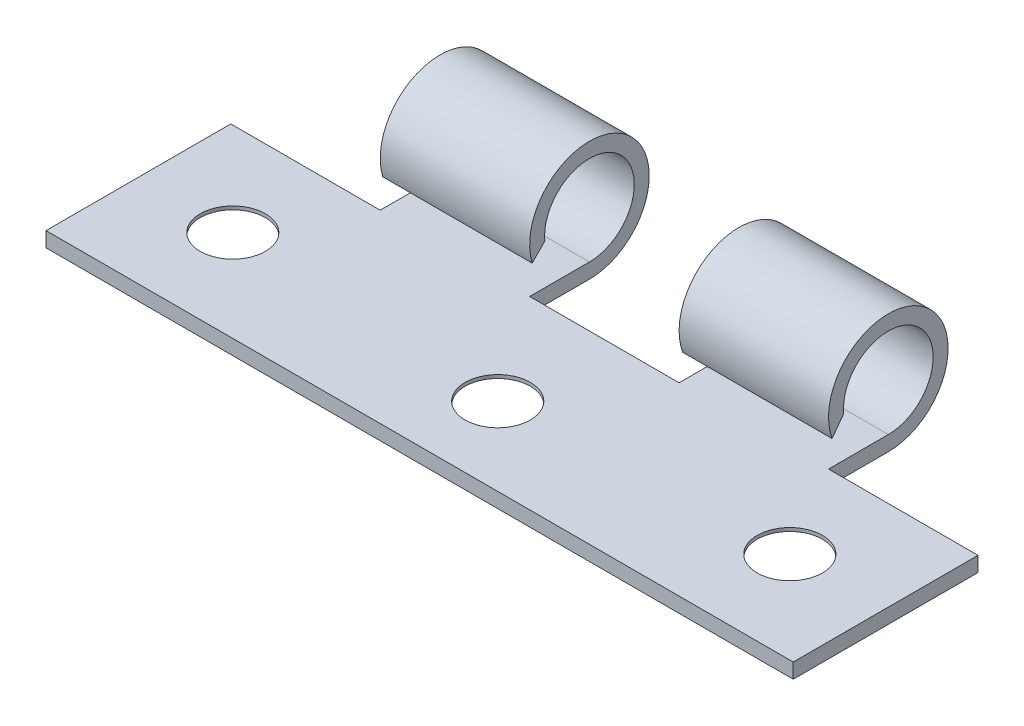
ISO-10303-21;
HEADER;
FILE_DESCRIPTION(('STEP AP214'),'2;1');
FILE_NAME('part.step','',(''),(''),'','','');
FILE_SCHEMA(('AUTOMOTIVE_DESIGN { 1 0 10303 214 1 1 1 1 }'));
ENDSEC;
DATA;
#1=APPLICATION_CONTEXT('core data for automotive mechanical design processes');
#2=APPLICATION_PROTOCOL_DEFINITION('international standard','automotive_design',2000,#1);
#3=PRODUCT_CONTEXT('',#1,'mechanical');
#4=PRODUCT('Part','Part','',(#3));
#5=PRODUCT_RELATED_PRODUCT_CATEGORY('part','',(#4));
#6=PRODUCT_DEFINITION_FORMATION('','',#4);
#7=PRODUCT_DEFINITION_CONTEXT('part definition',#1,'design');
#8=PRODUCT_DEFINITION('design','',#6,#7);
#9=PRODUCT_DEFINITION_SHAPE('','',#8);
#10=(LENGTH_UNIT() NAMED_UNIT(*) SI_UNIT(.MILLI.,.METRE.));
#11=(NAMED_UNIT(*) PLANE_ANGLE_UNIT() SI_UNIT($,.RADIAN.));
#12=(NAMED_UNIT(*) SI_UNIT($,.STERADIAN.) SOLID_ANGLE_UNIT());
#13=UNCERTAINTY_MEASURE_WITH_UNIT(LENGTH_MEASURE(1.E-05),#10,'distance_accuracy_value','');
#14=(GEOMETRIC_REPRESENTATION_CONTEXT(3) GLOBAL_UNCERTAINTY_ASSIGNED_CONTEXT((#13)) GLOBAL_UNIT_ASSIGNED_CONTEXT((#10,
#11,#12)) REPRESENTATION_CONTEXT('',''));
#15=CARTESIAN_POINT('',(0.,0.,0.));
#16=DIRECTION('',(0.,0.,1.));
#17=DIRECTION('',(1.,0.,0.));
#18=AXIS2_PLACEMENT_3D('',#15,#16,#17);
#19=CARTESIAN_POINT('',(51.1029999999999,4.40000000000012,-38.4174999999999));
#20=DIRECTION('',(1.,0.,0.));
#21=DIRECTION('',(0.,0.,-1.));
#22=AXIS2_PLACEMENT_3D('',#19,#20,#21);
#23=PLANE('',#22);
#24=DIRECTION('',(0.,-1.,0.));
#25=VECTOR('',#24,1.);
#26=CARTESIAN_POINT('',(51.1029999999999,1.15575951586955E-13,-34.0175));
#27=LINE('',#26,#25);
#28=CARTESIAN_POINT('',(51.1029999999999,1.10000000000012,-34.0175));
#29=VERTEX_POINT('',#28);
#30=CARTESIAN_POINT('',(51.1029999999999,1.15575951586955E-13,-34.0175));
#31=VERTEX_POINT('',#30);
#32=EDGE_CURVE('E249',#29,#31,#27,.T.);
#33=ORIENTED_EDGE('',*,*,#32,.F.);
#34=DIRECTION('',(0.,0.,1.));
#35=VECTOR('',#34,1.);
#36=CARTESIAN_POINT('',(51.1029999999999,1.10000000000012,-38.4174999999999));
#37=LINE('',#36,#35);
#38=CARTESIAN_POINT('',(51.1029999999999,1.10000000000012,-38.4174999999999));
#39=VERTEX_POINT('',#38);
#40=EDGE_CURVE('E272',#39,#29,#37,.T.);
#41=ORIENTED_EDGE('',*,*,#40,.F.);
#42=CARTESIAN_POINT('',(51.1029999999999,4.40000000000012,-38.4174999999999));
#43=DIRECTION('',(-1.,0.,0.));
#44=DIRECTION('',(0.,0.,1.));
#45=AXIS2_PLACEMENT_3D('',#42,#43,#44);
#46=CIRCLE('',#45,3.3);
#47=CARTESIAN_POINT('',(51.1029999999999,4.07339261630598,-35.1337022570023));
#48=VERTEX_POINT('',#47);
#49=EDGE_CURVE('E269',#48,#39,#46,.T.);
#50=ORIENTED_EDGE('',*,*,#49,.F.);
#51=DIRECTION('',(0.,0.80289370017341,-0.596122224230778));
#52=VECTOR('',#51,1.);
#53=CARTESIAN_POINT('',(51.1029999999999,2.91684775626548,-34.2750056521577));
#54=LINE('',#53,#52);
#55=CARTESIAN_POINT('',(51.1029999999999,2.91684775626548,-34.2750056521577));
#56=VERTEX_POINT('',#55);
#57=EDGE_CURVE('E265',#56,#48,#54,.T.);
#58=ORIENTED_EDGE('',*,*,#57,.F.);
#59=CARTESIAN_POINT('',(51.1029999999999,4.40000000000012,-38.4174999999999));
#60=DIRECTION('',(1.,0.,0.));
#61=DIRECTION('',(0.,0.,-1.));
#62=AXIS2_PLACEMENT_3D('',#59,#60,#61);
#63=CIRCLE('',#62,4.39999999999995);
#64=CARTESIAN_POINT('',(51.1029999999999,2.22044604925031E-13,-38.4175));
#65=VERTEX_POINT('',#64);
#66=EDGE_CURVE('E262',#65,#56,#63,.T.);
#67=ORIENTED_EDGE('',*,*,#66,.F.);
#68=DIRECTION('',(0.,0.,-1.));
#69=VECTOR('',#68,1.);
#70=CARTESIAN_POINT('',(51.1029999999999,1.15359111152458E-13,-20.4174999999999));
#71=LINE('',#70,#69);
#72=EDGE_CURVE('E275',#31,#65,#71,.T.);
#73=ORIENTED_EDGE('',*,*,#72,.F.);
#74=EDGE_LOOP('',(#33,#41,#50,#58,#67,#73));
#75=FACE_BOUND('',#74,.T.);
#76=ADVANCED_FACE('F45',(#75),#23,.F.);
#77=CARTESIAN_POINT('',(51.1029999999999,4.40000000000012,-38.4174999999999));
#78=DIRECTION('',(1.,0.,0.));
#79=DIRECTION('',(0.,0.,-1.));
#80=AXIS2_PLACEMENT_3D('',#77,#78,#79);
#81=CYLINDRICAL_SURFACE('',#80,4.39999999999995);
#82=CARTESIAN_POINT('',(62.1029999999999,4.40000000000012,-38.4174999999999));
#83=DIRECTION('',(1.,0.,0.));
#84=DIRECTION('',(0.,0.,-1.));
#85=AXIS2_PLACEMENT_3D('',#82,#83,#84);
#86=CIRCLE('',#85,4.39999999999995);
#87=CARTESIAN_POINT('',(62.1029999999999,2.22044604925031E-13,-38.4175));
#88=VERTEX_POINT('',#87);
#89=CARTESIAN_POINT('',(62.1029999999999,2.91684775626548,-34.2750056521577));
#90=VERTEX_POINT('',#89);
#91=EDGE_CURVE('E261',#88,#90,#86,.T.);
#92=ORIENTED_EDGE('',*,*,#91,.F.);
#93=DIRECTION('',(1.,0.,0.));
#94=VECTOR('',#93,1.);
#95=CARTESIAN_POINT('',(51.1029999999999,2.22044604925031E-13,-38.4175));
#96=LINE('',#95,#94);
#97=EDGE_CURVE('E289',#65,#88,#96,.T.);
#98=ORIENTED_EDGE('',*,*,#97,.F.);
#99=ORIENTED_EDGE('',*,*,#66,.T.);
#100=DIRECTION('',(1.,0.,0.));
#101=VECTOR('',#100,1.);
#102=CARTESIAN_POINT('',(51.1029999999999,2.91684775626548,-34.2750056521577));
#103=LINE('',#102,#101);
#104=EDGE_CURVE('E277',#56,#90,#103,.T.);
#105=ORIENTED_EDGE('',*,*,#104,.T.);
#106=EDGE_LOOP('',(#92,#98,#99,#105));
#107=FACE_BOUND('',#106,.T.);
#108=ADVANCED_FACE('F323',(#107),#81,.T.);
#109=CARTESIAN_POINT('',(51.1029999999999,1.15359111152458E-13,-20.4174999999999));
#110=DIRECTION('',(0.,-1.,0.));
#111=DIRECTION('',(0.,0.,-1.));
#112=AXIS2_PLACEMENT_3D('',#109,#110,#111);
#113=PLANE('',#112);
#114=CARTESIAN_POINT('',(66.1029999999999,1.55366171317173E-13,-27.1674999999999));
#115=DIRECTION('',(0.,-1.,0.));
#116=DIRECTION('',(0.,0.,-1.));
#117=AXIS2_PLACEMENT_3D('',#114,#115,#116);
#118=CIRCLE('',#117,3.8722431864331);
#119=CARTESIAN_POINT('',(66.1029999999999,1.78316847783009E-13,-31.0397431864331));
#120=VERTEX_POINT('',#119);
#121=EDGE_CURVE('E303',#120,#120,#118,.F.);
#122=ORIENTED_EDGE('',*,*,#121,.T.);
#123=EDGE_LOOP('',(#122));
#124=FACE_BOUND('',#123,.T.);
#125=CARTESIAN_POINT('',(45.6029999999999,1.49439199440919E-13,-26.1674999999999));
#126=DIRECTION('',(0.,-1.,0.));
#127=DIRECTION('',(0.,0.,-1.));
#128=AXIS2_PLACEMENT_3D('',#125,#126,#127);
#129=CIRCLE('',#128,3.8722431864331);
#130=CARTESIAN_POINT('',(45.6029999999999,1.72389875904924E-13,-30.039743186433));
#131=VERTEX_POINT('',#130);
#132=EDGE_CURVE('E300',#131,#131,#129,.F.);
#133=ORIENTED_EDGE('',*,*,#132,.T.);
#134=EDGE_LOOP('',(#133));
#135=FACE_BOUND('',#134,.T.);
#136=CARTESIAN_POINT('',(25.1029999999999,1.55366171317173E-13,-27.1674999999999));
#137=DIRECTION('',(0.,-1.,0.));
#138=DIRECTION('',(0.,0.,-1.));
#139=AXIS2_PLACEMENT_3D('',#136,#137,#138);
#140=CIRCLE('',#139,3.8722431864331);
#141=CARTESIAN_POINT('',(25.1029999999999,1.78316847783009E-13,-31.0397431864331));
#142=VERTEX_POINT('',#141);
#143=EDGE_CURVE('E292',#142,#142,#140,.F.);
#144=ORIENTED_EDGE('',*,*,#143,.T.);
#145=EDGE_LOOP('',(#144));
#146=FACE_BOUND('',#145,.T.);
#147=DIRECTION('',(0.,0.,-1.));
#148=VECTOR('',#147,1.);
#149=CARTESIAN_POINT('',(62.1029999999999,1.15359111152458E-13,-20.4174999999999));
#150=LINE('',#149,#148);
#151=CARTESIAN_POINT('',(62.1029999999999,1.95965928669513E-13,-34.0175));
#152=VERTEX_POINT('',#151);
#153=EDGE_CURVE('E266',#152,#88,#150,.T.);
#154=ORIENTED_EDGE('',*,*,#153,.F.);
#155=DIRECTION('',(-1.,0.,0.));
#156=VECTOR('',#155,1.);
#157=CARTESIAN_POINT('',(73.1029999999999,0.,-34.0175));
#158=LINE('',#157,#156);
#159=CARTESIAN_POINT('',(73.1029999999999,0.,-34.0175));
#160=VERTEX_POINT('',#159);
#161=EDGE_CURVE('E195',#160,#152,#158,.T.);
#162=ORIENTED_EDGE('',*,*,#161,.F.);
#163=DIRECTION('',(0.,0.,-1.));
#164=VECTOR('',#163,1.);
#165=CARTESIAN_POINT('',(73.1029999999999,0.,-34.0175));
#166=LINE('',#165,#164);
#167=CARTESIAN_POINT('',(73.1029999999999,0.,-20.4175));
#168=VERTEX_POINT('',#167);
#169=EDGE_CURVE('E179',#168,#160,#166,.T.);
#170=ORIENTED_EDGE('',*,*,#169,.F.);
#171=DIRECTION('',(1.,0.,0.));
#172=VECTOR('',#171,1.);
#173=CARTESIAN_POINT('',(51.1029999999999,1.15359111152458E-13,-20.4174999999999));
#174=LINE('',#173,#172);
#175=CARTESIAN_POINT('',(18.1029999999999,0.,-20.4174999999999));
#176=VERTEX_POINT('',#175);
#177=EDGE_CURVE('E171',#176,#168,#174,.T.);
#178=ORIENTED_EDGE('',*,*,#177,.F.);
#179=DIRECTION('',(0.,0.,1.));
#180=VECTOR('',#179,1.);
#181=CARTESIAN_POINT('',(18.1029999999999,0.,-20.4174999999999));
#182=LINE('',#181,#180);
#183=CARTESIAN_POINT('',(18.1029999999999,0.,-34.0174999999999));
#184=VERTEX_POINT('',#183);
#185=EDGE_CURVE('E201',#184,#176,#182,.T.);
#186=ORIENTED_EDGE('',*,*,#185,.F.);
#187=DIRECTION('',(1.,0.,0.));
#188=VECTOR('',#187,1.);
#189=CARTESIAN_POINT('',(18.1029999999999,0.,-34.0174999999999));
#190=LINE('',#189,#188);
#191=CARTESIAN_POINT('',(29.1029999999999,0.,-34.0174999999999));
#192=VERTEX_POINT('',#191);
#193=EDGE_CURVE('E211',#184,#192,#190,.T.);
#194=ORIENTED_EDGE('',*,*,#193,.T.);
#195=DIRECTION('',(0.,0.,1.));
#196=VECTOR('',#195,1.);
#197=CARTESIAN_POINT('',(29.1029999999999,1.1553921218298E-13,-20.4174999999999));
#198=LINE('',#197,#196);
#199=CARTESIAN_POINT('',(29.1029999999999,1.12757025938492E-13,-38.4174999999999));
#200=VERTEX_POINT('',#199);
#201=EDGE_CURVE('E223',#200,#192,#198,.T.);
#202=ORIENTED_EDGE('',*,*,#201,.F.);
#203=DIRECTION('',(1.,0.,0.));
#204=VECTOR('',#203,1.);
#205=CARTESIAN_POINT('',(29.1029999999999,1.12757025938492E-13,-38.4174999999999));
#206=LINE('',#205,#204);
#207=CARTESIAN_POINT('',(40.1029999999999,1.12757025938492E-13,-38.4174999999999));
#208=VERTEX_POINT('',#207);
#209=EDGE_CURVE('E240',#200,#208,#206,.T.);
#210=ORIENTED_EDGE('',*,*,#209,.T.);
#211=DIRECTION('',(0.,0.,1.));
#212=VECTOR('',#211,1.);
#213=CARTESIAN_POINT('',(40.1029999999999,1.1553921218298E-13,-20.4174999999999));
#214=LINE('',#213,#212);
#215=CARTESIAN_POINT('',(40.1029999999999,1.13437115909367E-13,-34.0175));
#216=VERTEX_POINT('',#215);
#217=EDGE_CURVE('E234',#208,#216,#214,.T.);
#218=ORIENTED_EDGE('',*,*,#217,.T.);
#219=DIRECTION('',(1.,0.,0.));
#220=VECTOR('',#219,1.);
#221=CARTESIAN_POINT('',(40.1029999999999,1.15575951586955E-13,-34.0175));
#222=LINE('',#221,#220);
#223=EDGE_CURVE('E253',#216,#31,#222,.T.);
#224=ORIENTED_EDGE('',*,*,#223,.T.);
#225=ORIENTED_EDGE('',*,*,#72,.T.);
#226=ORIENTED_EDGE('',*,*,#97,.T.);
#227=EDGE_LOOP('',(#154,#162,#170,#178,#186,#194,#202,#210,#218,#224,#225,#226));
#228=FACE_BOUND('',#227,.T.);
#229=ADVANCED_FACE('F320',(#124,#135,#146,#228),#113,.T.);
#230=CARTESIAN_POINT('',(51.1029999999999,1.10000000000011,-20.4174999999999));
#231=DIRECTION('',(0.,0.,1.));
#232=DIRECTION('',(1.,0.,0.));
#233=AXIS2_PLACEMENT_3D('',#230,#231,#232);
#234=PLANE('',#233);
#235=ORIENTED_EDGE('',*,*,#177,.T.);
#236=DIRECTION('',(0.,-1.,0.));
#237=VECTOR('',#236,1.);
#238=CARTESIAN_POINT('',(73.1029999999999,0.,-20.4175));
#239=LINE('',#238,#237);
#240=CARTESIAN_POINT('',(73.1029999999999,1.1,-20.4175));
#241=VERTEX_POINT('',#240);
#242=EDGE_CURVE('E175',#241,#168,#239,.T.);
#243=ORIENTED_EDGE('',*,*,#242,.F.);
#244=DIRECTION('',(1.,0.,0.));
#245=VECTOR('',#244,1.);
#246=CARTESIAN_POINT('',(51.1029999999999,1.10000000000011,-20.4174999999999));
#247=LINE('',#246,#245);
#248=CARTESIAN_POINT('',(18.1029999999999,1.1,-20.4174999999999));
#249=VERTEX_POINT('',#248);
#250=EDGE_CURVE('E159',#249,#241,#247,.T.);
#251=ORIENTED_EDGE('',*,*,#250,.F.);
#252=DIRECTION('',(0.,1.,0.));
#253=VECTOR('',#252,1.);
#254=CARTESIAN_POINT('',(18.1029999999999,1.1,-20.4174999999999));
#255=LINE('',#254,#253);
#256=EDGE_CURVE('E204',#176,#249,#255,.T.);
#257=ORIENTED_EDGE('',*,*,#256,.F.);
#258=EDGE_LOOP('',(#235,#243,#251,#257));
#259=FACE_BOUND('',#258,.T.);
#260=ADVANCED_FACE('F176',(#259),#234,.T.);
#261=CARTESIAN_POINT('',(51.1029999999999,1.10000000000012,-38.4174999999999));
#262=DIRECTION('',(0.,1.,0.));
#263=DIRECTION('',(0.,0.,1.));
#264=AXIS2_PLACEMENT_3D('',#261,#262,#263);
#265=PLANE('',#264);
#266=CARTESIAN_POINT('',(45.6029999999999,1.10000000000026,-26.1674999999999));
#267=DIRECTION('',(0.,1.,0.));
#268=DIRECTION('',(0.,0.,1.));
#269=AXIS2_PLACEMENT_3D('',#266,#267,#268);
#270=CIRCLE('',#269,2.4);
#271=CARTESIAN_POINT('',(45.6029999999999,1.10000000000025,-23.7674999999999));
#272=VERTEX_POINT('',#271);
#273=EDGE_CURVE('E431',#272,#272,#270,.T.);
#274=ORIENTED_EDGE('',*,*,#273,.F.);
#275=EDGE_LOOP('',(#274));
#276=FACE_BOUND('',#275,.T.);
#277=CARTESIAN_POINT('',(25.1029999999999,1.10000000000027,-27.1674999999999));
#278=DIRECTION('',(0.,1.,0.));
#279=DIRECTION('',(0.,0.,1.));
#280=AXIS2_PLACEMENT_3D('',#277,#278,#279);
#281=CIRCLE('',#280,2.4);
#282=CARTESIAN_POINT('',(25.1029999999999,1.10000000000025,-24.7674999999999));
#283=VERTEX_POINT('',#282);
#284=EDGE_CURVE('E429',#283,#283,#281,.T.);
#285=ORIENTED_EDGE('',*,*,#284,.F.);
#286=EDGE_LOOP('',(#285));
#287=FACE_BOUND('',#286,.T.);
#288=CARTESIAN_POINT('',(66.1029999999999,1.10000000000027,-27.1674999999999));
#289=DIRECTION('',(0.,1.,0.));
#290=DIRECTION('',(0.,0.,1.));
#291=AXIS2_PLACEMENT_3D('',#288,#289,#290);
#292=CIRCLE('',#291,2.4);
#293=CARTESIAN_POINT('',(66.1029999999999,1.10000000000025,-24.7674999999999));
#294=VERTEX_POINT('',#293);
#295=EDGE_CURVE('E186',#294,#294,#292,.T.);
#296=ORIENTED_EDGE('',*,*,#295,.F.);
#297=EDGE_LOOP('',(#296));
#298=FACE_BOUND('',#297,.T.);
#299=DIRECTION('',(0.,0.,1.));
#300=VECTOR('',#299,1.);
#301=CARTESIAN_POINT('',(62.1029999999999,1.10000000000012,-38.4174999999999));
#302=LINE('',#301,#300);
#303=CARTESIAN_POINT('',(62.1029999999999,1.10000000000012,-38.4174999999999));
#304=VERTEX_POINT('',#303);
#305=CARTESIAN_POINT('',(62.1029999999999,1.1,-34.0175));
#306=VERTEX_POINT('',#305);
#307=EDGE_CURVE('E286',#304,#306,#302,.T.);
#308=ORIENTED_EDGE('',*,*,#307,.F.);
#309=DIRECTION('',(1.,0.,0.));
#310=VECTOR('',#309,1.);
#311=CARTESIAN_POINT('',(51.1029999999999,1.10000000000012,-38.4174999999999));
#312=LINE('',#311,#310);
#313=EDGE_CURVE('E172',#39,#304,#312,.T.);
#314=ORIENTED_EDGE('',*,*,#313,.F.);
#315=ORIENTED_EDGE('',*,*,#40,.T.);
#316=DIRECTION('',(1.,0.,0.));
#317=VECTOR('',#316,1.);
#318=CARTESIAN_POINT('',(40.1029999999999,1.10000000000012,-34.0175));
#319=LINE('',#318,#317);
#320=CARTESIAN_POINT('',(40.1029999999999,1.10000000000012,-34.0175));
#321=VERTEX_POINT('',#320);
#322=EDGE_CURVE('E258',#321,#29,#319,.T.);
#323=ORIENTED_EDGE('',*,*,#322,.F.);
#324=DIRECTION('',(0.,0.,-1.));
#325=VECTOR('',#324,1.);
#326=CARTESIAN_POINT('',(40.1029999999999,1.10000000000011,-38.4174999999999));
#327=LINE('',#326,#325);
#328=CARTESIAN_POINT('',(40.1029999999999,1.10000000000011,-38.4174999999999));
#329=VERTEX_POINT('',#328);
#330=EDGE_CURVE('E219',#321,#329,#327,.T.);
#331=ORIENTED_EDGE('',*,*,#330,.T.);
#332=DIRECTION('',(1.,0.,0.));
#333=VECTOR('',#332,1.);
#334=CARTESIAN_POINT('',(29.1029999999999,1.10000000000011,-38.4174999999999));
#335=LINE('',#334,#333);
#336=CARTESIAN_POINT('',(29.1029999999999,1.10000000000011,-38.4174999999999));
#337=VERTEX_POINT('',#336);
#338=EDGE_CURVE('E227',#337,#329,#335,.T.);
#339=ORIENTED_EDGE('',*,*,#338,.F.);
#340=DIRECTION('',(0.,0.,-1.));
#341=VECTOR('',#340,1.);
#342=CARTESIAN_POINT('',(29.1029999999999,1.10000000000011,-38.4174999999999));
#343=LINE('',#342,#341);
#344=CARTESIAN_POINT('',(29.1029999999999,1.10000000000011,-34.0174999999999));
#345=VERTEX_POINT('',#344);
#346=EDGE_CURVE('E225',#345,#337,#343,.T.);
#347=ORIENTED_EDGE('',*,*,#346,.F.);
#348=DIRECTION('',(1.,0.,0.));
#349=VECTOR('',#348,1.);
#350=CARTESIAN_POINT('',(18.1029999999999,1.1,-34.0174999999999));
#351=LINE('',#350,#349);
#352=CARTESIAN_POINT('',(18.1029999999999,1.1,-34.0174999999999));
#353=VERTEX_POINT('',#352);
#354=EDGE_CURVE('E207',#353,#345,#351,.T.);
#355=ORIENTED_EDGE('',*,*,#354,.F.);
#356=DIRECTION('',(0.,0.,-1.));
#357=VECTOR('',#356,1.);
#358=CARTESIAN_POINT('',(18.1029999999999,1.1,-34.0174999999999));
#359=LINE('',#358,#357);
#360=EDGE_CURVE('E167',#249,#353,#359,.T.);
#361=ORIENTED_EDGE('',*,*,#360,.F.);
#362=ORIENTED_EDGE('',*,*,#250,.T.);
#363=DIRECTION('',(0.,0.,1.));
#364=VECTOR('',#363,1.);
#365=CARTESIAN_POINT('',(73.1029999999999,1.1,-20.4175));
#366=LINE('',#365,#364);
#367=CARTESIAN_POINT('',(73.1029999999999,1.1,-34.0175));
#368=VERTEX_POINT('',#367);
#369=EDGE_CURVE('E165',#368,#241,#366,.T.);
#370=ORIENTED_EDGE('',*,*,#369,.F.);
#371=DIRECTION('',(-1.,0.,0.));
#372=VECTOR('',#371,1.);
#373=CARTESIAN_POINT('',(73.1029999999999,1.1,-34.0175));
#374=LINE('',#373,#372);
#375=EDGE_CURVE('E192',#368,#306,#374,.T.);
#376=ORIENTED_EDGE('',*,*,#375,.T.);
#377=EDGE_LOOP('',(#308,#314,#315,#323,#331,#339,#347,#355,#361,#362,#370,#376));
#378=FACE_BOUND('',#377,.T.);
#379=ADVANCED_FACE('F162',(#276,#287,#298,#378),#265,.T.);
#380=CARTESIAN_POINT('',(51.1029999999999,4.40000000000012,-38.4174999999999));
#381=DIRECTION('',(1.,0.,0.));
#382=DIRECTION('',(0.,0.,-1.));
#383=AXIS2_PLACEMENT_3D('',#380,#381,#382);
#384=CYLINDRICAL_SURFACE('',#383,3.3);
#385=CARTESIAN_POINT('',(62.1029999999999,4.40000000000012,-38.4174999999999));
#386=DIRECTION('',(-1.,0.,0.));
#387=DIRECTION('',(0.,0.,1.));
#388=AXIS2_PLACEMENT_3D('',#385,#386,#387);
#389=CIRCLE('',#388,3.3);
#390=CARTESIAN_POINT('',(62.1029999999999,4.07339261630598,-35.1337022570023));
#391=VERTEX_POINT('',#390);
#392=EDGE_CURVE('E283',#391,#304,#389,.T.);
#393=ORIENTED_EDGE('',*,*,#392,.F.);
#394=DIRECTION('',(1.,0.,0.));
#395=VECTOR('',#394,1.);
#396=CARTESIAN_POINT('',(51.1029999999999,4.07339261630598,-35.1337022570023));
#397=LINE('',#396,#395);
#398=EDGE_CURVE('E295',#48,#391,#397,.T.);
#399=ORIENTED_EDGE('',*,*,#398,.F.);
#400=ORIENTED_EDGE('',*,*,#49,.T.);
#401=ORIENTED_EDGE('',*,*,#313,.T.);
#402=EDGE_LOOP('',(#393,#399,#400,#401));
#403=FACE_BOUND('',#402,.T.);
#404=ADVANCED_FACE('F338',(#403),#384,.F.);
#405=CARTESIAN_POINT('',(51.1029999999999,2.91684775626548,-34.2750056521577));
#406=DIRECTION('',(0.,-0.596122224230778,-0.80289370017341));
#407=DIRECTION('',(0.,0.80289370017341,-0.596122224230778));
#408=AXIS2_PLACEMENT_3D('',#405,#406,#407);
#409=PLANE('',#408);
#410=DIRECTION('',(0.,0.80289370017341,-0.596122224230778));
#411=VECTOR('',#410,1.);
#412=CARTESIAN_POINT('',(62.1029999999999,2.91684775626548,-34.2750056521577));
#413=LINE('',#412,#411);
#414=EDGE_CURVE('E280',#90,#391,#413,.T.);
#415=ORIENTED_EDGE('',*,*,#414,.F.);
#416=ORIENTED_EDGE('',*,*,#104,.F.);
#417=ORIENTED_EDGE('',*,*,#57,.T.);
#418=ORIENTED_EDGE('',*,*,#398,.T.);
#419=EDGE_LOOP('',(#415,#416,#417,#418));
#420=FACE_BOUND('',#419,.T.);
#421=ADVANCED_FACE('F344',(#420),#409,.T.);
#422=CARTESIAN_POINT('',(62.1029999999999,4.40000000000012,-38.4174999999999));
#423=DIRECTION('',(1.,0.,0.));
#424=DIRECTION('',(0.,0.,-1.));
#425=AXIS2_PLACEMENT_3D('',#422,#423,#424);
#426=PLANE('',#425);
#427=DIRECTION('',(0.,1.,0.));
#428=VECTOR('',#427,1.);
#429=CARTESIAN_POINT('',(62.1029999999999,1.1,-34.0175));
#430=LINE('',#429,#428);
#431=EDGE_CURVE('E61',#152,#306,#430,.T.);
#432=ORIENTED_EDGE('',*,*,#431,.F.);
#433=ORIENTED_EDGE('',*,*,#153,.T.);
#434=ORIENTED_EDGE('',*,*,#91,.T.);
#435=ORIENTED_EDGE('',*,*,#414,.T.);
#436=ORIENTED_EDGE('',*,*,#392,.T.);
#437=ORIENTED_EDGE('',*,*,#307,.T.);
#438=EDGE_LOOP('',(#432,#433,#434,#435,#436,#437));
#439=FACE_BOUND('',#438,.T.);
#440=ADVANCED_FACE('F335',(#439),#426,.T.);
#441=CARTESIAN_POINT('',(40.1029999999999,1.15575951586955E-13,-34.0175));
#442=DIRECTION('',(0.,0.,1.));
#443=DIRECTION('',(0.,-1.,0.));
#444=AXIS2_PLACEMENT_3D('',#441,#442,#443);
#445=PLANE('',#444);
#446=ORIENTED_EDGE('',*,*,#32,.T.);
#447=ORIENTED_EDGE('',*,*,#223,.F.);
#448=DIRECTION('',(0.,-1.,0.));
#449=VECTOR('',#448,1.);
#450=CARTESIAN_POINT('',(40.1029999999999,1.15575951586955E-13,-34.0175));
#451=LINE('',#450,#449);
#452=EDGE_CURVE('E250',#321,#216,#451,.T.);
#453=ORIENTED_EDGE('',*,*,#452,.F.);
#454=ORIENTED_EDGE('',*,*,#322,.T.);
#455=EDGE_LOOP('',(#446,#447,#453,#454));
#456=FACE_BOUND('',#455,.T.);
#457=ADVANCED_FACE('F347',(#456),#445,.F.);
#458=CARTESIAN_POINT('',(40.1029999999999,4.40000000000011,-38.4174999999999));
#459=DIRECTION('',(-1.,0.,0.));
#460=DIRECTION('',(0.,0.,1.));
#461=AXIS2_PLACEMENT_3D('',#458,#459,#460);
#462=PLANE('',#461);
#463=ORIENTED_EDGE('',*,*,#330,.F.);
#464=ORIENTED_EDGE('',*,*,#452,.T.);
#465=ORIENTED_EDGE('',*,*,#217,.F.);
#466=CARTESIAN_POINT('',(40.1029999999999,4.40000000000011,-38.4174999999999));
#467=DIRECTION('',(-1.,0.,0.));
#468=DIRECTION('',(0.,0.,-1.));
#469=AXIS2_PLACEMENT_3D('',#466,#467,#468);
#470=CIRCLE('',#469,4.4);
#471=CARTESIAN_POINT('',(40.1029999999999,3.13386024449318,-34.2036074860024));
#472=VERTEX_POINT('',#471);
#473=EDGE_CURVE('E232',#472,#208,#470,.T.);
#474=ORIENTED_EDGE('',*,*,#473,.F.);
#475=DIRECTION('',(0.,-0.710667097324672,0.703528447740477));
#476=VECTOR('',#475,1.);
#477=CARTESIAN_POINT('',(40.1029999999999,4.07339261630597,-35.1337022570023));
#478=LINE('',#477,#476);
#479=CARTESIAN_POINT('',(40.1029999999999,4.07339261630597,-35.1337022570023));
#480=VERTEX_POINT('',#479);
#481=EDGE_CURVE('E230',#480,#472,#478,.T.);
#482=ORIENTED_EDGE('',*,*,#481,.F.);
#483=CARTESIAN_POINT('',(40.1029999999999,4.40000000000011,-38.4174999999999));
#484=DIRECTION('',(1.,0.,0.));
#485=DIRECTION('',(0.,0.,1.));
#486=AXIS2_PLACEMENT_3D('',#483,#484,#485);
#487=CIRCLE('',#486,3.3);
#488=EDGE_CURVE('E214',#329,#480,#487,.T.);
#489=ORIENTED_EDGE('',*,*,#488,.F.);
#490=EDGE_LOOP('',(#463,#464,#465,#474,#482,#489));
#491=FACE_BOUND('',#490,.T.);
#492=ADVANCED_FACE('F355',(#491),#462,.F.);
#493=CARTESIAN_POINT('',(29.1029999999999,4.40000000000011,-38.4174999999999));
#494=DIRECTION('',(1.,0.,0.));
#495=DIRECTION('',(0.,0.,-1.));
#496=AXIS2_PLACEMENT_3D('',#493,#494,#495);
#497=CYLINDRICAL_SURFACE('',#496,3.3);
#498=ORIENTED_EDGE('',*,*,#488,.T.);
#499=DIRECTION('',(1.,0.,0.));
#500=VECTOR('',#499,1.);
#501=CARTESIAN_POINT('',(29.1029999999999,4.07339261630597,-35.1337022570023));
#502=LINE('',#501,#500);
#503=CARTESIAN_POINT('',(29.1029999999999,4.07339261630597,-35.1337022570023));
#504=VERTEX_POINT('',#503);
#505=EDGE_CURVE('E246',#504,#480,#502,.T.);
#506=ORIENTED_EDGE('',*,*,#505,.F.);
#507=CARTESIAN_POINT('',(29.1029999999999,4.40000000000011,-38.4174999999999));
#508=DIRECTION('',(1.,0.,0.));
#509=DIRECTION('',(0.,0.,1.));
#510=AXIS2_PLACEMENT_3D('',#507,#508,#509);
#511=CIRCLE('',#510,3.3);
#512=EDGE_CURVE('E215',#337,#504,#511,.T.);
#513=ORIENTED_EDGE('',*,*,#512,.F.);
#514=ORIENTED_EDGE('',*,*,#338,.T.);
#515=EDGE_LOOP('',(#498,#506,#513,#514));
#516=FACE_BOUND('',#515,.T.);
#517=ADVANCED_FACE('F360',(#516),#497,.F.);
#518=CARTESIAN_POINT('',(29.1029999999999,4.07339261630597,-35.1337022570023));
#519=DIRECTION('',(0.,0.703528447740477,0.710667097324672));
#520=DIRECTION('',(0.,-0.710667097324672,0.703528447740477));
#521=AXIS2_PLACEMENT_3D('',#518,#519,#520);
#522=PLANE('',#521);
#523=ORIENTED_EDGE('',*,*,#481,.T.);
#524=DIRECTION('',(1.,0.,0.));
#525=VECTOR('',#524,1.);
#526=CARTESIAN_POINT('',(29.1029999999999,3.13386024449318,-34.2036074860024));
#527=LINE('',#526,#525);
#528=CARTESIAN_POINT('',(29.1029999999999,3.13386024449318,-34.2036074860024));
#529=VERTEX_POINT('',#528);
#530=EDGE_CURVE('E243',#529,#472,#527,.T.);
#531=ORIENTED_EDGE('',*,*,#530,.F.);
#532=DIRECTION('',(0.,-0.710667097324672,0.703528447740477));
#533=VECTOR('',#532,1.);
#534=CARTESIAN_POINT('',(29.1029999999999,4.07339261630597,-35.1337022570023));
#535=LINE('',#534,#533);
#536=EDGE_CURVE('E218',#504,#529,#535,.T.);
#537=ORIENTED_EDGE('',*,*,#536,.F.);
#538=ORIENTED_EDGE('',*,*,#505,.T.);
#539=EDGE_LOOP('',(#523,#531,#537,#538));
#540=FACE_BOUND('',#539,.T.);
#541=ADVANCED_FACE('F374',(#540),#522,.F.);
#542=CARTESIAN_POINT('',(29.1029999999999,4.40000000000011,-38.4174999999999));
#543=DIRECTION('',(1.,0.,0.));
#544=DIRECTION('',(0.,0.,-1.));
#545=AXIS2_PLACEMENT_3D('',#542,#543,#544);
#546=CYLINDRICAL_SURFACE('',#545,4.4);
#547=ORIENTED_EDGE('',*,*,#473,.T.);
#548=ORIENTED_EDGE('',*,*,#209,.F.);
#549=CARTESIAN_POINT('',(29.1029999999999,4.40000000000011,-38.4174999999999));
#550=DIRECTION('',(-1.,0.,0.));
#551=DIRECTION('',(0.,0.,-1.));
#552=AXIS2_PLACEMENT_3D('',#549,#550,#551);
#553=CIRCLE('',#552,4.4);
#554=EDGE_CURVE('E221',#529,#200,#553,.T.);
#555=ORIENTED_EDGE('',*,*,#554,.F.);
#556=ORIENTED_EDGE('',*,*,#530,.T.);
#557=EDGE_LOOP('',(#547,#548,#555,#556));
#558=FACE_BOUND('',#557,.T.);
#559=ADVANCED_FACE('F372',(#558),#546,.T.);
#560=CARTESIAN_POINT('',(29.1029999999999,4.40000000000011,-38.4174999999999));
#561=DIRECTION('',(-1.,0.,0.));
#562=DIRECTION('',(0.,0.,1.));
#563=AXIS2_PLACEMENT_3D('',#560,#561,#562);
#564=PLANE('',#563);
#565=DIRECTION('',(0.,-1.,0.));
#566=VECTOR('',#565,1.);
#567=CARTESIAN_POINT('',(29.1029999999999,0.,-34.0174999999999));
#568=LINE('',#567,#566);
#569=EDGE_CURVE('E69',#345,#192,#568,.T.);
#570=ORIENTED_EDGE('',*,*,#569,.F.);
#571=ORIENTED_EDGE('',*,*,#346,.T.);
#572=ORIENTED_EDGE('',*,*,#512,.T.);
#573=ORIENTED_EDGE('',*,*,#536,.T.);
#574=ORIENTED_EDGE('',*,*,#554,.T.);
#575=ORIENTED_EDGE('',*,*,#201,.T.);
#576=EDGE_LOOP('',(#570,#571,#572,#573,#574,#575));
#577=FACE_BOUND('',#576,.T.);
#578=ADVANCED_FACE('F362',(#577),#564,.T.);
#579=CARTESIAN_POINT('',(18.1029999999999,0.,-34.0174999999999));
#580=DIRECTION('',(0.,0.,1.));
#581=DIRECTION('',(1.,0.,0.));
#582=AXIS2_PLACEMENT_3D('',#579,#580,#581);
#583=PLANE('',#582);
#584=ORIENTED_EDGE('',*,*,#569,.T.);
#585=ORIENTED_EDGE('',*,*,#193,.F.);
#586=DIRECTION('',(0.,-1.,0.));
#587=VECTOR('',#586,1.);
#588=CARTESIAN_POINT('',(18.1029999999999,0.,-34.0174999999999));
#589=LINE('',#588,#587);
#590=EDGE_CURVE('E198',#353,#184,#589,.T.);
#591=ORIENTED_EDGE('',*,*,#590,.F.);
#592=ORIENTED_EDGE('',*,*,#354,.T.);
#593=EDGE_LOOP('',(#584,#585,#591,#592));
#594=FACE_BOUND('',#593,.T.);
#595=ADVANCED_FACE('F366',(#594),#583,.F.);
#596=CARTESIAN_POINT('',(18.1029999999999,0.,0.));
#597=DIRECTION('',(1.,0.,0.));
#598=DIRECTION('',(0.,0.,-1.));
#599=AXIS2_PLACEMENT_3D('',#596,#597,#598);
#600=PLANE('',#599);
#601=ORIENTED_EDGE('',*,*,#590,.T.);
#602=ORIENTED_EDGE('',*,*,#185,.T.);
#603=ORIENTED_EDGE('',*,*,#256,.T.);
#604=ORIENTED_EDGE('',*,*,#360,.T.);
#605=EDGE_LOOP('',(#601,#602,#603,#604));
#606=FACE_BOUND('',#605,.T.);
#607=ADVANCED_FACE('F369',(#606),#600,.F.);
#608=CARTESIAN_POINT('',(73.1029999999999,1.1,-34.0175));
#609=DIRECTION('',(0.,0.,1.));
#610=DIRECTION('',(1.,0.,0.));
#611=AXIS2_PLACEMENT_3D('',#608,#609,#610);
#612=PLANE('',#611);
#613=ORIENTED_EDGE('',*,*,#431,.T.);
#614=ORIENTED_EDGE('',*,*,#375,.F.);
#615=DIRECTION('',(0.,1.,0.));
#616=VECTOR('',#615,1.);
#617=CARTESIAN_POINT('',(73.1029999999999,1.1,-34.0175));
#618=LINE('',#617,#616);
#619=EDGE_CURVE('E183',#160,#368,#618,.T.);
#620=ORIENTED_EDGE('',*,*,#619,.F.);
#621=ORIENTED_EDGE('',*,*,#161,.T.);
#622=EDGE_LOOP('',(#613,#614,#620,#621));
#623=FACE_BOUND('',#622,.T.);
#624=ADVANCED_FACE('F332',(#623),#612,.F.);
#625=CARTESIAN_POINT('',(73.1029999999999,0.,0.));
#626=DIRECTION('',(-1.,0.,0.));
#627=DIRECTION('',(0.,0.,1.));
#628=AXIS2_PLACEMENT_3D('',#625,#626,#627);
#629=PLANE('',#628);
#630=ORIENTED_EDGE('',*,*,#369,.T.);
#631=ORIENTED_EDGE('',*,*,#242,.T.);
#632=ORIENTED_EDGE('',*,*,#169,.T.);
#633=ORIENTED_EDGE('',*,*,#619,.T.);
#634=EDGE_LOOP('',(#630,#631,#632,#633));
#635=FACE_BOUND('',#634,.T.);
#636=ADVANCED_FACE('F181',(#635),#629,.F.);
#637=CARTESIAN_POINT('',(66.1029999999999,1.10000000000026,-27.1674999999999));
#638=DIRECTION('',(0.,1.,0.));
#639=DIRECTION('',(0.,0.,1.));
#640=AXIS2_PLACEMENT_3D('',#637,#638,#639);
#641=CYLINDRICAL_SURFACE('',#640,2.4);
#642=CARTESIAN_POINT('',(66.1029999999999,0.849999999999904,-27.1674999999999));
#643=DIRECTION('',(0.,-1.,0.));
#644=DIRECTION('',(0.,0.,-1.));
#645=AXIS2_PLACEMENT_3D('',#642,#643,#644);
#646=CIRCLE('',#645,2.4);
#647=CARTESIAN_POINT('',(66.1029999999999,0.849999999999924,-29.5674999999999));
#648=VERTEX_POINT('',#647);
#649=EDGE_CURVE('E306',#648,#648,#646,.T.);
#650=ORIENTED_EDGE('',*,*,#649,.T.);
#651=EDGE_LOOP('',(#650));
#652=FACE_BOUND('',#651,.T.);
#653=ORIENTED_EDGE('',*,*,#295,.T.);
#654=EDGE_LOOP('',(#653));
#655=FACE_BOUND('',#654,.T.);
#656=ADVANCED_FACE('F422',(#652,#655),#641,.F.);
#657=CARTESIAN_POINT('',(25.1029999999999,1.10000000000026,-27.1674999999999));
#658=DIRECTION('',(0.,1.,0.));
#659=DIRECTION('',(0.,0.,1.));
#660=AXIS2_PLACEMENT_3D('',#657,#658,#659);
#661=CYLINDRICAL_SURFACE('',#660,2.4);
#662=CARTESIAN_POINT('',(25.1029999999999,0.849999999999904,-27.1674999999999));
#663=DIRECTION('',(0.,-1.,0.));
#664=DIRECTION('',(0.,0.,-1.));
#665=AXIS2_PLACEMENT_3D('',#662,#663,#664);
#666=CIRCLE('',#665,2.4);
#667=CARTESIAN_POINT('',(25.1029999999999,0.849999999999924,-29.5674999999999));
#668=VERTEX_POINT('',#667);
#669=EDGE_CURVE('E11',#668,#668,#666,.T.);
#670=ORIENTED_EDGE('',*,*,#669,.T.);
#671=EDGE_LOOP('',(#670));
#672=FACE_BOUND('',#671,.T.);
#673=ORIENTED_EDGE('',*,*,#284,.T.);
#674=EDGE_LOOP('',(#673));
#675=FACE_BOUND('',#674,.T.);
#676=ADVANCED_FACE('F416',(#672,#675),#661,.F.);
#677=CARTESIAN_POINT('',(45.6029999999999,1.10000000000026,-26.1674999999999));
#678=DIRECTION('',(0.,1.,0.));
#679=DIRECTION('',(0.,0.,1.));
#680=AXIS2_PLACEMENT_3D('',#677,#678,#679);
#681=CYLINDRICAL_SURFACE('',#680,2.4);
#682=CARTESIAN_POINT('',(45.6029999999999,0.849999999999898,-26.1674999999999));
#683=DIRECTION('',(0.,-1.,0.));
#684=DIRECTION('',(0.,0.,-1.));
#685=AXIS2_PLACEMENT_3D('',#682,#683,#684);
#686=CIRCLE('',#685,2.4);
#687=CARTESIAN_POINT('',(45.6029999999999,0.849999999999918,-28.5674999999999));
#688=VERTEX_POINT('',#687);
#689=EDGE_CURVE('E54',#688,#688,#686,.T.);
#690=ORIENTED_EDGE('',*,*,#689,.T.);
#691=EDGE_LOOP('',(#690));
#692=FACE_BOUND('',#691,.T.);
#693=ORIENTED_EDGE('',*,*,#273,.T.);
#694=EDGE_LOOP('',(#693));
#695=FACE_BOUND('',#694,.T.);
#696=ADVANCED_FACE('F311',(#692,#695),#681,.F.);
#697=CARTESIAN_POINT('',(66.1029999999999,1.55257751099924E-13,-27.1674999999999));
#698=DIRECTION('',(0.,-1.,0.));
#699=DIRECTION('',(0.,0.,-1.));
#700=AXIS2_PLACEMENT_3D('',#697,#698,#699);
#701=CONICAL_SURFACE('',#700,3.87224318643311,1.0471975511966);
#702=CARTESIAN_POINT('',(66.1029999999999,0.849999999999924,-29.5674999999999));
#703=CARTESIAN_POINT('',(66.1029999999999,0.84114583333326,-29.5828358665253));
#704=CARTESIAN_POINT('',(66.1029999999999,0.832291666666596,-29.5981717330506));
#705=CARTESIAN_POINT('',(66.1029999999999,0.814583333333268,-29.6288434661013));
#706=CARTESIAN_POINT('',(66.1029999999999,0.805729166666604,-29.6441793326267));
#707=CARTESIAN_POINT('',(66.1029999999999,0.788020833333276,-29.6748510656774));
#708=CARTESIAN_POINT('',(66.1029999999999,0.779166666666612,-29.6901869322027));
#709=CARTESIAN_POINT('',(66.1029999999999,0.761458333333284,-29.7208586652534));
#710=CARTESIAN_POINT('',(66.1029999999999,0.752604166666619,-29.7361945317787));
#711=CARTESIAN_POINT('',(66.1029999999999,0.734895833333291,-29.7668662648294));
#712=CARTESIAN_POINT('',(66.1029999999999,0.726041666666628,-29.7822021313548));
#713=CARTESIAN_POINT('',(66.1029999999999,0.7083333333333,-29.8128738644055));
#714=CARTESIAN_POINT('',(66.1029999999999,0.699479166666635,-29.8282097309308));
#715=CARTESIAN_POINT('',(66.1029999999999,0.681770833333307,-29.8588814639815));
#716=CARTESIAN_POINT('',(66.1029999999999,0.672916666666643,-29.8742173305068));
#717=CARTESIAN_POINT('',(66.1029999999999,0.655208333333315,-29.9048890635575));
#718=CARTESIAN_POINT('',(66.1029999999999,0.646354166666651,-29.9202249300829));
#719=CARTESIAN_POINT('',(66.1029999999999,0.628645833333323,-29.9508966631336));
#720=CARTESIAN_POINT('',(66.1029999999999,0.619791666666659,-29.9662325296589));
#721=CARTESIAN_POINT('',(66.1029999999999,0.602083333333331,-29.9969042627096));
#722=CARTESIAN_POINT('',(66.1029999999999,0.593229166666667,-30.0122401292349));
#723=CARTESIAN_POINT('',(66.1029999999999,0.575520833333339,-30.0429118622856));
#724=CARTESIAN_POINT('',(66.1029999999999,0.566666666666675,-30.058247728811));
#725=CARTESIAN_POINT('',(66.1029999999999,0.548958333333347,-30.0889194618617));
#726=CARTESIAN_POINT('',(66.1029999999999,0.540104166666683,-30.104255328387));
#727=CARTESIAN_POINT('',(66.1029999999999,0.522395833333355,-30.1349270614377));
#728=CARTESIAN_POINT('',(66.1029999999999,0.513541666666691,-30.150262927963));
#729=CARTESIAN_POINT('',(66.1029999999999,0.495833333333363,-30.1809346610137));
#730=CARTESIAN_POINT('',(66.1029999999999,0.486979166666699,-30.1962705275391));
#731=CARTESIAN_POINT('',(66.1029999999999,0.469270833333371,-30.2269422605898));
#732=CARTESIAN_POINT('',(66.1029999999999,0.460416666666707,-30.2422781271151));
#733=CARTESIAN_POINT('',(66.1029999999999,0.442708333333379,-30.2729498601658));
#734=CARTESIAN_POINT('',(66.1029999999999,0.433854166666715,-30.2882857266912));
#735=CARTESIAN_POINT('',(66.1029999999999,0.416145833333387,-30.3189574597418));
#736=CARTESIAN_POINT('',(66.1029999999999,0.407291666666723,-30.3342933262672));
#737=CARTESIAN_POINT('',(66.1029999999999,0.389583333333395,-30.3649650593179));
#738=CARTESIAN_POINT('',(66.1029999999999,0.380729166666731,-30.3803009258432));
#739=CARTESIAN_POINT('',(66.1029999999999,0.363020833333403,-30.4109726588939));
#740=CARTESIAN_POINT('',(66.1029999999999,0.354166666666739,-30.4263085254193));
#741=CARTESIAN_POINT('',(66.1029999999999,0.336458333333411,-30.45698025847));
#742=CARTESIAN_POINT('',(66.1029999999999,0.327604166666747,-30.4723161249953));
#743=CARTESIAN_POINT('',(66.1029999999999,0.309895833333419,-30.502987858046));
#744=CARTESIAN_POINT('',(66.1029999999999,0.301041666666755,-30.5183237245713));
#745=CARTESIAN_POINT('',(66.1029999999999,0.283333333333427,-30.548995457622));
#746=CARTESIAN_POINT('',(66.1029999999999,0.274479166666763,-30.5643313241474));
#747=CARTESIAN_POINT('',(66.1029999999999,0.256770833333435,-30.5950030571981));
#748=CARTESIAN_POINT('',(66.1029999999999,0.24791666666677,-30.6103389237234));
#749=CARTESIAN_POINT('',(66.1029999999999,0.230208333333443,-30.6410106567741));
#750=CARTESIAN_POINT('',(66.1029999999999,0.221354166666779,-30.6563465232994));
#751=CARTESIAN_POINT('',(66.1029999999999,0.203645833333451,-30.6870182563501));
#752=CARTESIAN_POINT('',(66.1029999999999,0.194791666666787,-30.7023541228755));
#753=CARTESIAN_POINT('',(66.1029999999999,0.177083333333459,-30.7330258559262));
#754=CARTESIAN_POINT('',(66.1029999999999,0.168229166666795,-30.7483617224515));
#755=CARTESIAN_POINT('',(66.1029999999999,0.150520833333467,-30.7790334555022));
#756=CARTESIAN_POINT('',(66.1029999999999,0.141666666666802,-30.7943693220275));
#757=CARTESIAN_POINT('',(66.1029999999999,0.123958333333474,-30.8250410550782));
#758=CARTESIAN_POINT('',(66.1029999999999,0.11510416666681,-30.8403769216036));
#759=CARTESIAN_POINT('',(66.1029999999999,0.0973958333334824,-30.8710486546543));
#760=CARTESIAN_POINT('',(66.1029999999999,0.0885416666668183,-30.8863845211796));
#761=CARTESIAN_POINT('',(66.1029999999999,0.0708333333334905,-30.9170562542303));
#762=CARTESIAN_POINT('',(66.1029999999999,0.0619791666668266,-30.9323921207557));
#763=CARTESIAN_POINT('',(66.1029999999999,0.0442708333334986,-30.9630638538063));
#764=CARTESIAN_POINT('',(66.1029999999999,0.0354166666668343,-30.9783997203317));
#765=CARTESIAN_POINT('',(66.1029999999999,0.0177083333335058,-31.0090714533824));
#766=CARTESIAN_POINT('',(66.1029999999999,0.00885416666684159,-31.0244073199077));
#767=CARTESIAN_POINT('',(66.1029999999999,1.78303241749989E-13,-31.0397431864331));
#768=B_SPLINE_CURVE_WITH_KNOTS('',3,(#702,#703,#704,#705,#706,#707,#708,#709,#710,#711,#712,
#713,#714,#715,#716,#717,#718,#719,#720,#721,#722,#723,#724,#725,#726,#727,#728,#729,#730,#731,
#732,#733,#734,#735,#736,#737,#738,#739,#740,#741,#742,#743,#744,#745,#746,#747,#748,#749,#750,
#751,#752,#753,#754,#755,#756,#757,#758,#759,#760,#761,#762,#763,#764,#765,#766,#767),
.UNSPECIFIED.,.F.,.F.,(4,2,2,2,2,2,2,2,2,2,2,2,2,2,2,2,2,2,2,2,2,2,2,2,2,2,2,2,2,2,2,2,4),(0.,
0.0531249999999848,0.10624999999997,0.159374999999954,0.212499999999936,0.265624999999924,
0.318749999999906,0.371874999999891,0.424999999999878,0.478124999999863,0.531249999999848,
0.584374999999833,0.637499999999817,0.690624999999802,0.743749999999787,0.796874999999772,
0.849999999999757,0.903124999999741,0.956249999999726,1.00937499999971,1.0624999999997,
1.11562499999968,1.16874999999967,1.22187499999965,1.27499999999964,1.32812499999962,
1.38124999999961,1.43437499999959,1.48749999999958,1.54062499999956,1.59374999999955,
1.64687499999953,1.69999999999951),.UNSPECIFIED.);
#769=EDGE_CURVE('BSEAM317',#648,#120,#768,.T.);
#770=ORIENTED_EDGE('',*,*,#649,.F.);
#771=ORIENTED_EDGE('',*,*,#121,.F.);
#772=ORIENTED_EDGE('',*,*,#769,.T.);
#773=ORIENTED_EDGE('',*,*,#769,.F.);
#774=EDGE_LOOP('',(#770,#772,#771,#773));
#775=FACE_BOUND('',#774,.T.);
#776=ADVANCED_FACE('F317',(#775),#701,.F.);
#777=CARTESIAN_POINT('',(45.6029999999999,1.49403059368503E-13,-26.1674999999999));
#778=DIRECTION('',(0.,-1.,0.));
#779=DIRECTION('',(0.,0.,-1.));
#780=AXIS2_PLACEMENT_3D('',#777,#778,#779);
#781=CONICAL_SURFACE('',#780,3.87224318643311,1.0471975511966);
#782=ORIENTED_EDGE('',*,*,#689,.F.);
#783=EDGE_LOOP('',(#782));
#784=FACE_BOUND('',#783,.T.);
#785=ORIENTED_EDGE('',*,*,#132,.F.);
#786=EDGE_LOOP('',(#785));
#787=FACE_BOUND('',#786,.T.);
#788=ADVANCED_FACE('F314',(#784,#787),#781,.F.);
#789=CARTESIAN_POINT('',(25.1029999999999,1.55257751099924E-13,-27.1674999999999));
#790=DIRECTION('',(0.,-1.,0.));
#791=DIRECTION('',(0.,0.,-1.));
#792=AXIS2_PLACEMENT_3D('',#789,#790,#791);
#793=CONICAL_SURFACE('',#792,3.87224318643311,1.0471975511966);
#794=CARTESIAN_POINT('',(25.1029999999999,0.849999999999924,-29.5674999999999));
#795=CARTESIAN_POINT('',(25.1029999999999,0.84114583333326,-29.5828358665253));
#796=CARTESIAN_POINT('',(25.1029999999999,0.832291666666596,-29.5981717330506));
#797=CARTESIAN_POINT('',(25.1029999999999,0.814583333333268,-29.6288434661013));
#798=CARTESIAN_POINT('',(25.1029999999999,0.805729166666604,-29.6441793326267));
#799=CARTESIAN_POINT('',(25.1029999999999,0.788020833333276,-29.6748510656774));
#800=CARTESIAN_POINT('',(25.1029999999999,0.779166666666612,-29.6901869322027));
#801=CARTESIAN_POINT('',(25.1029999999999,0.761458333333284,-29.7208586652534));
#802=CARTESIAN_POINT('',(25.1029999999999,0.752604166666619,-29.7361945317787));
#803=CARTESIAN_POINT('',(25.1029999999999,0.734895833333291,-29.7668662648294));
#804=CARTESIAN_POINT('',(25.1029999999999,0.726041666666628,-29.7822021313548));
#805=CARTESIAN_POINT('',(25.1029999999999,0.7083333333333,-29.8128738644055));
#806=CARTESIAN_POINT('',(25.1029999999999,0.699479166666635,-29.8282097309308));
#807=CARTESIAN_POINT('',(25.1029999999999,0.681770833333307,-29.8588814639815));
#808=CARTESIAN_POINT('',(25.1029999999999,0.672916666666643,-29.8742173305068));
#809=CARTESIAN_POINT('',(25.1029999999999,0.655208333333315,-29.9048890635575));
#810=CARTESIAN_POINT('',(25.1029999999999,0.646354166666651,-29.9202249300829));
#811=CARTESIAN_POINT('',(25.1029999999999,0.628645833333323,-29.9508966631336));
#812=CARTESIAN_POINT('',(25.1029999999999,0.619791666666659,-29.9662325296589));
#813=CARTESIAN_POINT('',(25.1029999999999,0.602083333333331,-29.9969042627096));
#814=CARTESIAN_POINT('',(25.1029999999999,0.593229166666667,-30.0122401292349));
#815=CARTESIAN_POINT('',(25.1029999999999,0.575520833333339,-30.0429118622856));
#816=CARTESIAN_POINT('',(25.1029999999999,0.566666666666675,-30.058247728811));
#817=CARTESIAN_POINT('',(25.1029999999999,0.548958333333347,-30.0889194618617));
#818=CARTESIAN_POINT('',(25.1029999999999,0.540104166666683,-30.104255328387));
#819=CARTESIAN_POINT('',(25.1029999999999,0.522395833333355,-30.1349270614377));
#820=CARTESIAN_POINT('',(25.1029999999999,0.513541666666691,-30.150262927963));
#821=CARTESIAN_POINT('',(25.1029999999999,0.495833333333363,-30.1809346610137));
#822=CARTESIAN_POINT('',(25.1029999999999,0.486979166666699,-30.1962705275391));
#823=CARTESIAN_POINT('',(25.1029999999999,0.469270833333371,-30.2269422605898));
#824=CARTESIAN_POINT('',(25.1029999999999,0.460416666666707,-30.2422781271151));
#825=CARTESIAN_POINT('',(25.1029999999999,0.442708333333379,-30.2729498601658));
#826=CARTESIAN_POINT('',(25.1029999999999,0.433854166666715,-30.2882857266912));
#827=CARTESIAN_POINT('',(25.1029999999999,0.416145833333387,-30.3189574597418));
#828=CARTESIAN_POINT('',(25.1029999999999,0.407291666666723,-30.3342933262672));
#829=CARTESIAN_POINT('',(25.1029999999999,0.389583333333395,-30.3649650593179));
#830=CARTESIAN_POINT('',(25.1029999999999,0.380729166666731,-30.3803009258432));
#831=CARTESIAN_POINT('',(25.1029999999999,0.363020833333403,-30.4109726588939));
#832=CARTESIAN_POINT('',(25.1029999999999,0.354166666666739,-30.4263085254193));
#833=CARTESIAN_POINT('',(25.1029999999999,0.336458333333411,-30.45698025847));
#834=CARTESIAN_POINT('',(25.1029999999999,0.327604166666747,-30.4723161249953));
#835=CARTESIAN_POINT('',(25.1029999999999,0.309895833333419,-30.502987858046));
#836=CARTESIAN_POINT('',(25.1029999999999,0.301041666666755,-30.5183237245713));
#837=CARTESIAN_POINT('',(25.1029999999999,0.283333333333427,-30.548995457622));
#838=CARTESIAN_POINT('',(25.1029999999999,0.274479166666763,-30.5643313241474));
#839=CARTESIAN_POINT('',(25.1029999999999,0.256770833333435,-30.5950030571981));
#840=CARTESIAN_POINT('',(25.1029999999999,0.24791666666677,-30.6103389237234));
#841=CARTESIAN_POINT('',(25.1029999999999,0.230208333333443,-30.6410106567741));
#842=CARTESIAN_POINT('',(25.1029999999999,0.221354166666779,-30.6563465232994));
#843=CARTESIAN_POINT('',(25.1029999999999,0.203645833333451,-30.6870182563501));
#844=CARTESIAN_POINT('',(25.1029999999999,0.194791666666787,-30.7023541228755));
#845=CARTESIAN_POINT('',(25.1029999999999,0.177083333333459,-30.7330258559262));
#846=CARTESIAN_POINT('',(25.1029999999999,0.168229166666795,-30.7483617224515));
#847=CARTESIAN_POINT('',(25.1029999999999,0.150520833333467,-30.7790334555022));
#848=CARTESIAN_POINT('',(25.1029999999999,0.141666666666802,-30.7943693220275));
#849=CARTESIAN_POINT('',(25.1029999999999,0.123958333333474,-30.8250410550782));
#850=CARTESIAN_POINT('',(25.1029999999999,0.11510416666681,-30.8403769216036));
#851=CARTESIAN_POINT('',(25.1029999999999,0.0973958333334824,-30.8710486546543));
#852=CARTESIAN_POINT('',(25.1029999999999,0.0885416666668183,-30.8863845211796));
#853=CARTESIAN_POINT('',(25.1029999999999,0.0708333333334905,-30.9170562542303));
#854=CARTESIAN_POINT('',(25.1029999999999,0.0619791666668266,-30.9323921207557));
#855=CARTESIAN_POINT('',(25.1029999999999,0.0442708333334986,-30.9630638538063));
#856=CARTESIAN_POINT('',(25.1029999999999,0.0354166666668343,-30.9783997203317));
#857=CARTESIAN_POINT('',(25.1029999999999,0.0177083333335058,-31.0090714533824));
#858=CARTESIAN_POINT('',(25.1029999999999,0.00885416666684159,-31.0244073199077));
#859=CARTESIAN_POINT('',(25.1029999999999,1.78303241749989E-13,-31.0397431864331));
#860=B_SPLINE_CURVE_WITH_KNOTS('',3,(#794,#795,#796,#797,#798,#799,#800,#801,#802,#803,#804,
#805,#806,#807,#808,#809,#810,#811,#812,#813,#814,#815,#816,#817,#818,#819,#820,#821,#822,#823,
#824,#825,#826,#827,#828,#829,#830,#831,#832,#833,#834,#835,#836,#837,#838,#839,#840,#841,#842,
#843,#844,#845,#846,#847,#848,#849,#850,#851,#852,#853,#854,#855,#856,#857,#858,#859),
.UNSPECIFIED.,.F.,.F.,(4,2,2,2,2,2,2,2,2,2,2,2,2,2,2,2,2,2,2,2,2,2,2,2,2,2,2,2,2,2,2,2,4),(0.,
0.0531249999999848,0.10624999999997,0.159374999999954,0.212499999999936,0.265624999999924,
0.318749999999906,0.371874999999891,0.424999999999878,0.478124999999863,0.531249999999848,
0.584374999999833,0.637499999999817,0.690624999999802,0.743749999999787,0.796874999999772,
0.849999999999757,0.903124999999741,0.956249999999726,1.00937499999971,1.0624999999997,
1.11562499999968,1.16874999999967,1.22187499999965,1.27499999999964,1.32812499999962,
1.38124999999961,1.43437499999959,1.48749999999958,1.54062499999956,1.59374999999955,
1.64687499999953,1.69999999999951),.UNSPECIFIED.);
#861=EDGE_CURVE('BSEAM48',#668,#142,#860,.T.);
#862=ORIENTED_EDGE('',*,*,#669,.F.);
#863=ORIENTED_EDGE('',*,*,#143,.F.);
#864=ORIENTED_EDGE('',*,*,#861,.T.);
#865=ORIENTED_EDGE('',*,*,#861,.F.);
#866=EDGE_LOOP('',(#862,#864,#863,#865));
#867=FACE_BOUND('',#866,.T.);
#868=ADVANCED_FACE('F48',(#867),#793,.F.);
#869=CLOSED_SHELL('',(#76,#108,#229,#260,#379,#404,#421,#440,#457,#492,#517,#541,#559,#578,#595,
#607,#624,#636,#656,#676,#696,#776,#788,#868));
#870=MANIFOLD_SOLID_BREP('B2',#869);
#871=ADVANCED_BREP_SHAPE_REPRESENTATION('',(#18,#870),#14);
#872=SHAPE_DEFINITION_REPRESENTATION(#9,#871);
ENDSEC;
END-ISO-10303-21;
